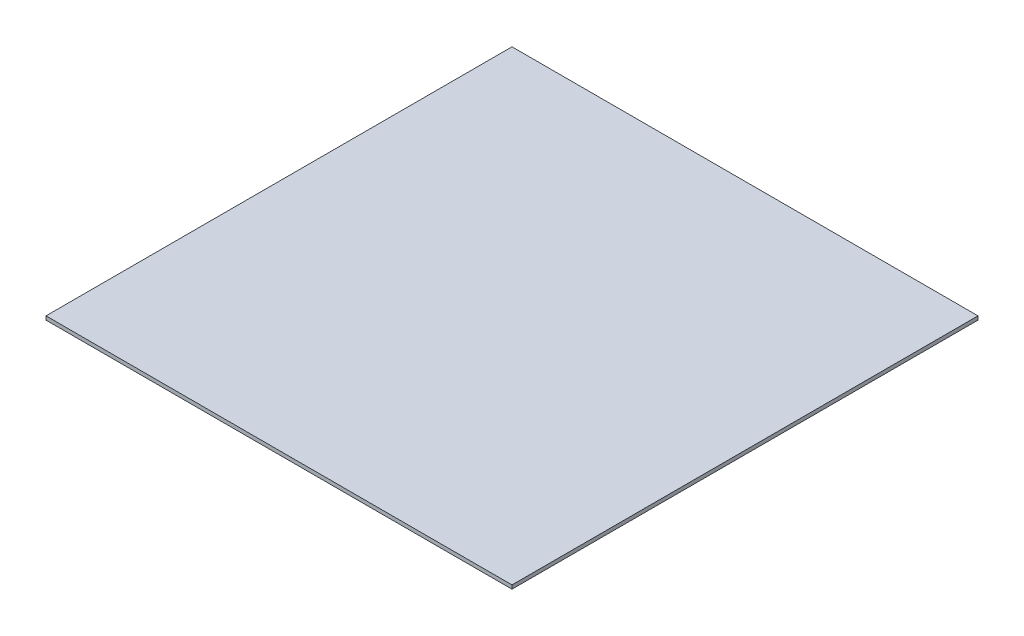
ISO-10303-21;
HEADER;
FILE_DESCRIPTION(('STEP AP214'),'2;1');
FILE_NAME('part.step','',(''),(''),'','','');
FILE_SCHEMA(('AUTOMOTIVE_DESIGN { 1 0 10303 214 1 1 1 1 }'));
ENDSEC;
DATA;
#1=APPLICATION_CONTEXT('core data for automotive mechanical design processes');
#2=APPLICATION_PROTOCOL_DEFINITION('international standard','automotive_design',2000,#1);
#3=PRODUCT_CONTEXT('',#1,'mechanical');
#4=PRODUCT('Part','Part','',(#3));
#5=PRODUCT_RELATED_PRODUCT_CATEGORY('part','',(#4));
#6=PRODUCT_DEFINITION_FORMATION('','',#4);
#7=PRODUCT_DEFINITION_CONTEXT('part definition',#1,'design');
#8=PRODUCT_DEFINITION('design','',#6,#7);
#9=PRODUCT_DEFINITION_SHAPE('','',#8);
#10=(LENGTH_UNIT() NAMED_UNIT(*) SI_UNIT(.MILLI.,.METRE.));
#11=(NAMED_UNIT(*) PLANE_ANGLE_UNIT() SI_UNIT($,.RADIAN.));
#12=(NAMED_UNIT(*) SI_UNIT($,.STERADIAN.) SOLID_ANGLE_UNIT());
#13=UNCERTAINTY_MEASURE_WITH_UNIT(LENGTH_MEASURE(1.E-05),#10,'distance_accuracy_value','');
#14=(GEOMETRIC_REPRESENTATION_CONTEXT(3) GLOBAL_UNCERTAINTY_ASSIGNED_CONTEXT((#13)) GLOBAL_UNIT_ASSIGNED_CONTEXT((#10,
#11,#12)) REPRESENTATION_CONTEXT('',''));
#15=CARTESIAN_POINT('',(0.,0.,0.));
#16=DIRECTION('',(0.,0.,1.));
#17=DIRECTION('',(1.,0.,0.));
#18=AXIS2_PLACEMENT_3D('',#15,#16,#17);
#19=CARTESIAN_POINT('',(-100.,1.6,-100.));
#20=DIRECTION('',(1.,0.,0.));
#21=DIRECTION('',(0.,0.,-1.));
#22=AXIS2_PLACEMENT_3D('',#19,#20,#21);
#23=PLANE('',#22);
#24=DIRECTION('',(0.,0.,1.));
#25=VECTOR('',#24,1.);
#26=CARTESIAN_POINT('',(-100.,0.,-100.));
#27=LINE('',#26,#25);
#28=CARTESIAN_POINT('',(-100.,0.,-100.));
#29=VERTEX_POINT('',#28);
#30=CARTESIAN_POINT('',(-100.,0.,100.));
#31=VERTEX_POINT('',#30);
#32=EDGE_CURVE('E98',#29,#31,#27,.T.);
#33=ORIENTED_EDGE('',*,*,#32,.T.);
#34=DIRECTION('',(0.,-1.,0.));
#35=VECTOR('',#34,1.);
#36=CARTESIAN_POINT('',(-100.,1.6,100.));
#37=LINE('',#36,#35);
#38=CARTESIAN_POINT('',(-100.,1.6,100.));
#39=VERTEX_POINT('',#38);
#40=EDGE_CURVE('E11',#39,#31,#37,.T.);
#41=ORIENTED_EDGE('',*,*,#40,.F.);
#42=DIRECTION('',(0.,0.,1.));
#43=VECTOR('',#42,1.);
#44=CARTESIAN_POINT('',(-100.,1.6,-100.));
#45=LINE('',#44,#43);
#46=CARTESIAN_POINT('',(-100.,1.6,-100.));
#47=VERTEX_POINT('',#46);
#48=EDGE_CURVE('E86',#47,#39,#45,.T.);
#49=ORIENTED_EDGE('',*,*,#48,.F.);
#50=DIRECTION('',(0.,-1.,0.));
#51=VECTOR('',#50,1.);
#52=CARTESIAN_POINT('',(-100.,1.6,-100.));
#53=LINE('',#52,#51);
#54=EDGE_CURVE('E94',#47,#29,#53,.T.);
#55=ORIENTED_EDGE('',*,*,#54,.T.);
#56=EDGE_LOOP('',(#33,#41,#49,#55));
#57=FACE_BOUND('',#56,.T.);
#58=ADVANCED_FACE('F35',(#57),#23,.F.);
#59=CARTESIAN_POINT('',(-100.,1.6,100.));
#60=DIRECTION('',(0.,0.,-1.));
#61=DIRECTION('',(-1.,0.,0.));
#62=AXIS2_PLACEMENT_3D('',#59,#60,#61);
#63=PLANE('',#62);
#64=DIRECTION('',(1.,0.,0.));
#65=VECTOR('',#64,1.);
#66=CARTESIAN_POINT('',(-100.,0.,100.));
#67=LINE('',#66,#65);
#68=CARTESIAN_POINT('',(100.,0.,100.));
#69=VERTEX_POINT('',#68);
#70=EDGE_CURVE('E90',#31,#69,#67,.T.);
#71=ORIENTED_EDGE('',*,*,#70,.T.);
#72=DIRECTION('',(0.,-1.,0.));
#73=VECTOR('',#72,1.);
#74=CARTESIAN_POINT('',(100.,1.6,100.));
#75=LINE('',#74,#73);
#76=CARTESIAN_POINT('',(100.,1.6,100.));
#77=VERTEX_POINT('',#76);
#78=EDGE_CURVE('E43',#77,#69,#75,.T.);
#79=ORIENTED_EDGE('',*,*,#78,.F.);
#80=DIRECTION('',(1.,0.,0.));
#81=VECTOR('',#80,1.);
#82=CARTESIAN_POINT('',(-100.,1.6,100.));
#83=LINE('',#82,#81);
#84=EDGE_CURVE('E81',#39,#77,#83,.T.);
#85=ORIENTED_EDGE('',*,*,#84,.F.);
#86=ORIENTED_EDGE('',*,*,#40,.T.);
#87=EDGE_LOOP('',(#71,#79,#85,#86));
#88=FACE_BOUND('',#87,.T.);
#89=ADVANCED_FACE('F89',(#88),#63,.F.);
#90=CARTESIAN_POINT('',(100.,1.6,-100.));
#91=DIRECTION('',(-1.,0.,0.));
#92=DIRECTION('',(0.,0.,1.));
#93=AXIS2_PLACEMENT_3D('',#90,#91,#92);
#94=PLANE('',#93);
#95=DIRECTION('',(0.,0.,-1.));
#96=VECTOR('',#95,1.);
#97=CARTESIAN_POINT('',(100.,0.,-100.));
#98=LINE('',#97,#96);
#99=CARTESIAN_POINT('',(100.,0.,-100.));
#100=VERTEX_POINT('',#99);
#101=EDGE_CURVE('E68',#69,#100,#98,.T.);
#102=ORIENTED_EDGE('',*,*,#101,.T.);
#103=DIRECTION('',(0.,-1.,0.));
#104=VECTOR('',#103,1.);
#105=CARTESIAN_POINT('',(100.,1.6,-100.));
#106=LINE('',#105,#104);
#107=CARTESIAN_POINT('',(100.,1.6,-100.));
#108=VERTEX_POINT('',#107);
#109=EDGE_CURVE('E91',#108,#100,#106,.T.);
#110=ORIENTED_EDGE('',*,*,#109,.F.);
#111=DIRECTION('',(0.,0.,-1.));
#112=VECTOR('',#111,1.);
#113=CARTESIAN_POINT('',(100.,1.6,-100.));
#114=LINE('',#113,#112);
#115=EDGE_CURVE('E84',#77,#108,#114,.T.);
#116=ORIENTED_EDGE('',*,*,#115,.F.);
#117=ORIENTED_EDGE('',*,*,#78,.T.);
#118=EDGE_LOOP('',(#102,#110,#116,#117));
#119=FACE_BOUND('',#118,.T.);
#120=ADVANCED_FACE('F92',(#119),#94,.F.);
#121=CARTESIAN_POINT('',(-100.,1.6,-100.));
#122=DIRECTION('',(0.,0.,1.));
#123=DIRECTION('',(1.,0.,0.));
#124=AXIS2_PLACEMENT_3D('',#121,#122,#123);
#125=PLANE('',#124);
#126=DIRECTION('',(-1.,0.,0.));
#127=VECTOR('',#126,1.);
#128=CARTESIAN_POINT('',(-100.,0.,-100.));
#129=LINE('',#128,#127);
#130=EDGE_CURVE('E74',#100,#29,#129,.T.);
#131=ORIENTED_EDGE('',*,*,#130,.T.);
#132=ORIENTED_EDGE('',*,*,#54,.F.);
#133=DIRECTION('',(-1.,0.,0.));
#134=VECTOR('',#133,1.);
#135=CARTESIAN_POINT('',(-100.,1.6,-100.));
#136=LINE('',#135,#134);
#137=EDGE_CURVE('E51',#108,#47,#136,.T.);
#138=ORIENTED_EDGE('',*,*,#137,.F.);
#139=ORIENTED_EDGE('',*,*,#109,.T.);
#140=EDGE_LOOP('',(#131,#132,#138,#139));
#141=FACE_BOUND('',#140,.T.);
#142=ADVANCED_FACE('F105',(#141),#125,.F.);
#143=CARTESIAN_POINT('',(0.,1.6,0.));
#144=DIRECTION('',(0.,1.,0.));
#145=DIRECTION('',(0.,0.,1.));
#146=AXIS2_PLACEMENT_3D('',#143,#144,#145);
#147=PLANE('',#146);
#148=ORIENTED_EDGE('',*,*,#48,.T.);
#149=ORIENTED_EDGE('',*,*,#84,.T.);
#150=ORIENTED_EDGE('',*,*,#115,.T.);
#151=ORIENTED_EDGE('',*,*,#137,.T.);
#152=EDGE_LOOP('',(#148,#149,#150,#151));
#153=FACE_BOUND('',#152,.T.);
#154=ADVANCED_FACE('F82',(#153),#147,.T.);
#155=CARTESIAN_POINT('',(0.,0.,0.));
#156=DIRECTION('',(0.,1.,0.));
#157=DIRECTION('',(0.,0.,1.));
#158=AXIS2_PLACEMENT_3D('',#155,#156,#157);
#159=PLANE('',#158);
#160=ORIENTED_EDGE('',*,*,#32,.F.);
#161=ORIENTED_EDGE('',*,*,#130,.F.);
#162=ORIENTED_EDGE('',*,*,#101,.F.);
#163=ORIENTED_EDGE('',*,*,#70,.F.);
#164=EDGE_LOOP('',(#160,#161,#162,#163));
#165=FACE_BOUND('',#164,.T.);
#166=ADVANCED_FACE('F108',(#165),#159,.F.);
#167=CLOSED_SHELL('',(#58,#89,#120,#142,#154,#166));
#168=MANIFOLD_SOLID_BREP('B2',#167);
#169=ADVANCED_BREP_SHAPE_REPRESENTATION('',(#18,#168),#14);
#170=SHAPE_DEFINITION_REPRESENTATION(#9,#169);
ENDSEC;
END-ISO-10303-21;
